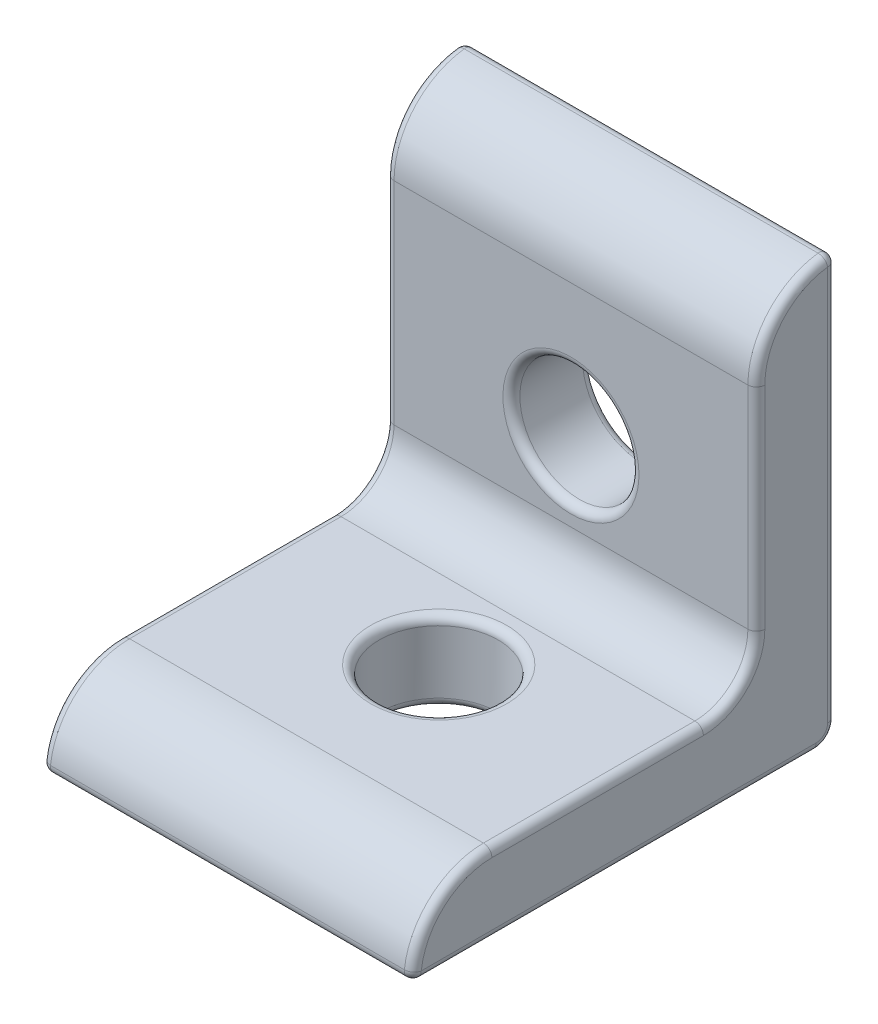
ISO-10303-21;
HEADER;
FILE_DESCRIPTION(('STEP AP214'),'2;1');
FILE_NAME('part.step','',(''),(''),'','','');
FILE_SCHEMA(('AUTOMOTIVE_DESIGN { 1 0 10303 214 1 1 1 1 }'));
ENDSEC;
DATA;
#1=APPLICATION_CONTEXT('core data for automotive mechanical design processes');
#2=APPLICATION_PROTOCOL_DEFINITION('international standard','automotive_design',2000,#1);
#3=PRODUCT_CONTEXT('',#1,'mechanical');
#4=PRODUCT('Part','Part','',(#3));
#5=PRODUCT_RELATED_PRODUCT_CATEGORY('part','',(#4));
#6=PRODUCT_DEFINITION_FORMATION('','',#4);
#7=PRODUCT_DEFINITION_CONTEXT('part definition',#1,'design');
#8=PRODUCT_DEFINITION('design','',#6,#7);
#9=PRODUCT_DEFINITION_SHAPE('','',#8);
#10=(LENGTH_UNIT() NAMED_UNIT(*) SI_UNIT(.MILLI.,.METRE.));
#11=(NAMED_UNIT(*) PLANE_ANGLE_UNIT() SI_UNIT($,.RADIAN.));
#12=(NAMED_UNIT(*) SI_UNIT($,.STERADIAN.) SOLID_ANGLE_UNIT());
#13=UNCERTAINTY_MEASURE_WITH_UNIT(LENGTH_MEASURE(1.E-05),#10,'distance_accuracy_value','');
#14=(GEOMETRIC_REPRESENTATION_CONTEXT(3) GLOBAL_UNCERTAINTY_ASSIGNED_CONTEXT((#13)) GLOBAL_UNIT_ASSIGNED_CONTEXT((#10,
#11,#12)) REPRESENTATION_CONTEXT('',''));
#15=CARTESIAN_POINT('',(0.,0.,0.));
#16=DIRECTION('',(0.,0.,1.));
#17=DIRECTION('',(1.,0.,0.));
#18=AXIS2_PLACEMENT_3D('',#15,#16,#17);
#19=CARTESIAN_POINT('',(-11.1125,-12.7,15.8496));
#20=DIRECTION('',(1.,0.,0.));
#21=DIRECTION('',(0.,0.,-1.));
#22=AXIS2_PLACEMENT_3D('',#19,#20,#21);
#23=CYLINDRICAL_SURFACE('',#22,4.7752);
#24=DIRECTION('',(1.,0.,0.));
#25=VECTOR('',#24,1.);
#26=CARTESIAN_POINT('',(-11.1125,-7.9248,15.8496));
#27=LINE('',#26,#25);
#28=CARTESIAN_POINT('',(-10.6045,-7.9248,15.8496));
#29=VERTEX_POINT('',#28);
#30=CARTESIAN_POINT('',(10.6045,-7.9248,15.8496));
#31=VERTEX_POINT('',#30);
#32=EDGE_CURVE('E213',#29,#31,#27,.T.);
#33=ORIENTED_EDGE('',*,*,#32,.F.);
#34=CARTESIAN_POINT('',(-10.6045,-12.7,15.8496));
#35=DIRECTION('',(1.,0.,0.));
#36=DIRECTION('',(0.,0.,-1.));
#37=AXIS2_PLACEMENT_3D('',#34,#35,#36);
#38=CIRCLE('',#37,4.7752);
#39=CARTESIAN_POINT('',(-10.6045,-12.1315238095238,20.5908413839481));
#40=VERTEX_POINT('',#39);
#41=EDGE_CURVE('E288',#29,#40,#38,.T.);
#42=ORIENTED_EDGE('',*,*,#41,.T.);
#43=DIRECTION('',(1.,0.,0.));
#44=VECTOR('',#43,1.);
#45=CARTESIAN_POINT('',(-11.1125,-12.1315238095238,20.5908413839481));
#46=LINE('',#45,#44);
#47=CARTESIAN_POINT('',(10.6045,-12.1315238095238,20.5908413839481));
#48=VERTEX_POINT('',#47);
#49=EDGE_CURVE('E282',#40,#48,#46,.T.);
#50=ORIENTED_EDGE('',*,*,#49,.T.);
#51=CARTESIAN_POINT('',(10.6045,-12.7,15.8496));
#52=DIRECTION('',(1.,0.,0.));
#53=DIRECTION('',(0.,0.,-1.));
#54=AXIS2_PLACEMENT_3D('',#51,#52,#53);
#55=CIRCLE('',#54,4.7752);
#56=EDGE_CURVE('E285',#48,#31,#55,.F.);
#57=ORIENTED_EDGE('',*,*,#56,.T.);
#58=EDGE_LOOP('',(#33,#42,#50,#57));
#59=FACE_BOUND('',#58,.T.);
#60=ADVANCED_FACE('F45',(#59),#23,.T.);
#61=CARTESIAN_POINT('',(-11.1125,-7.9248,3.175));
#62=DIRECTION('',(0.,1.,0.));
#63=DIRECTION('',(0.,0.,1.));
#64=AXIS2_PLACEMENT_3D('',#61,#62,#63);
#65=PLANE('',#64);
#66=CARTESIAN_POINT('',(0.,-7.9248,7.9248));
#67=DIRECTION('',(0.,1.,0.));
#68=DIRECTION('',(0.,0.,1.));
#69=AXIS2_PLACEMENT_3D('',#66,#67,#68);
#70=CIRCLE('',#69,4.0767);
#71=CARTESIAN_POINT('',(0.,-7.9248,12.0015));
#72=VERTEX_POINT('',#71);
#73=EDGE_CURVE('E420',#72,#72,#70,.F.);
#74=ORIENTED_EDGE('',*,*,#73,.T.);
#75=EDGE_LOOP('',(#74));
#76=FACE_BOUND('',#75,.T.);
#77=DIRECTION('',(1.,0.,0.));
#78=VECTOR('',#77,1.);
#79=CARTESIAN_POINT('',(-11.1125,-7.9248,3.175));
#80=LINE('',#79,#78);
#81=CARTESIAN_POINT('',(-10.6045,-7.9248,3.175));
#82=VERTEX_POINT('',#81);
#83=CARTESIAN_POINT('',(10.6045,-7.9248,3.175));
#84=VERTEX_POINT('',#83);
#85=EDGE_CURVE('E220',#82,#84,#80,.T.);
#86=ORIENTED_EDGE('',*,*,#85,.F.);
#87=DIRECTION('',(0.,0.,1.));
#88=VECTOR('',#87,1.);
#89=CARTESIAN_POINT('',(-10.6045,-7.9248,15.8496));
#90=LINE('',#89,#88);
#91=EDGE_CURVE('E295',#82,#29,#90,.T.);
#92=ORIENTED_EDGE('',*,*,#91,.T.);
#93=ORIENTED_EDGE('',*,*,#32,.T.);
#94=DIRECTION('',(0.,0.,1.));
#95=VECTOR('',#94,1.);
#96=CARTESIAN_POINT('',(10.6045,-7.9248,3.175));
#97=LINE('',#96,#95);
#98=EDGE_CURVE('E292',#31,#84,#97,.F.);
#99=ORIENTED_EDGE('',*,*,#98,.T.);
#100=EDGE_LOOP('',(#86,#92,#93,#99));
#101=FACE_BOUND('',#100,.T.);
#102=ADVANCED_FACE('F529',(#76,#101),#65,.T.);
#103=CARTESIAN_POINT('',(-11.1125,-4.7498,3.175));
#104=DIRECTION('',(1.,0.,0.));
#105=DIRECTION('',(0.,0.,-1.));
#106=AXIS2_PLACEMENT_3D('',#103,#104,#105);
#107=CYLINDRICAL_SURFACE('',#106,3.175);
#108=DIRECTION('',(1.,0.,0.));
#109=VECTOR('',#108,1.);
#110=CARTESIAN_POINT('',(-11.1125,-4.7498,0.));
#111=LINE('',#110,#109);
#112=CARTESIAN_POINT('',(-10.6045,-4.7498,0.));
#113=VERTEX_POINT('',#112);
#114=CARTESIAN_POINT('',(10.6045,-4.7498,0.));
#115=VERTEX_POINT('',#114);
#116=EDGE_CURVE('E611',#113,#115,#111,.T.);
#117=ORIENTED_EDGE('',*,*,#116,.F.);
#118=CARTESIAN_POINT('',(-10.6045,-4.7498,3.175));
#119=DIRECTION('',(1.,0.,0.));
#120=DIRECTION('',(0.,0.,-1.));
#121=AXIS2_PLACEMENT_3D('',#118,#119,#120);
#122=CIRCLE('',#121,3.175);
#123=EDGE_CURVE('E301',#113,#82,#122,.F.);
#124=ORIENTED_EDGE('',*,*,#123,.T.);
#125=ORIENTED_EDGE('',*,*,#85,.T.);
#126=CARTESIAN_POINT('',(10.6045,-4.7498,3.175));
#127=DIRECTION('',(1.,0.,0.));
#128=DIRECTION('',(0.,0.,-1.));
#129=AXIS2_PLACEMENT_3D('',#126,#127,#128);
#130=CIRCLE('',#129,3.175);
#131=EDGE_CURVE('E298',#84,#115,#130,.T.);
#132=ORIENTED_EDGE('',*,*,#131,.T.);
#133=EDGE_LOOP('',(#117,#124,#125,#132));
#134=FACE_BOUND('',#133,.T.);
#135=ADVANCED_FACE('F535',(#134),#107,.F.);
#136=CARTESIAN_POINT('',(-11.1125,7.9248,0.));
#137=DIRECTION('',(0.,0.,1.));
#138=DIRECTION('',(0.,-1.,0.));
#139=AXIS2_PLACEMENT_3D('',#136,#137,#138);
#140=PLANE('',#139);
#141=CARTESIAN_POINT('',(0.,0.,0.));
#142=DIRECTION('',(0.,0.,1.));
#143=DIRECTION('',(0.,-1.,0.));
#144=AXIS2_PLACEMENT_3D('',#141,#142,#143);
#145=CIRCLE('',#144,4.0767);
#146=CARTESIAN_POINT('',(0.,-4.0767,0.));
#147=VERTEX_POINT('',#146);
#148=EDGE_CURVE('E54',#147,#147,#145,.F.);
#149=ORIENTED_EDGE('',*,*,#148,.T.);
#150=EDGE_LOOP('',(#149));
#151=FACE_BOUND('',#150,.T.);
#152=DIRECTION('',(1.,0.,0.));
#153=VECTOR('',#152,1.);
#154=CARTESIAN_POINT('',(-11.1125,7.9248,0.));
#155=LINE('',#154,#153);
#156=CARTESIAN_POINT('',(-10.6045,7.9248,0.));
#157=VERTEX_POINT('',#156);
#158=CARTESIAN_POINT('',(10.6045,7.9248,0.));
#159=VERTEX_POINT('',#158);
#160=EDGE_CURVE('E223',#157,#159,#155,.T.);
#161=ORIENTED_EDGE('',*,*,#160,.F.);
#162=DIRECTION('',(0.,-1.,0.));
#163=VECTOR('',#162,1.);
#164=CARTESIAN_POINT('',(-10.6045,-4.7498,0.));
#165=LINE('',#164,#163);
#166=EDGE_CURVE('E307',#157,#113,#165,.T.);
#167=ORIENTED_EDGE('',*,*,#166,.T.);
#168=ORIENTED_EDGE('',*,*,#116,.T.);
#169=DIRECTION('',(0.,-1.,0.));
#170=VECTOR('',#169,1.);
#171=CARTESIAN_POINT('',(10.6045,7.9248,0.));
#172=LINE('',#171,#170);
#173=EDGE_CURVE('E304',#115,#159,#172,.F.);
#174=ORIENTED_EDGE('',*,*,#173,.T.);
#175=EDGE_LOOP('',(#161,#167,#168,#174));
#176=FACE_BOUND('',#175,.T.);
#177=ADVANCED_FACE('F436',(#151,#176),#140,.T.);
#178=CARTESIAN_POINT('',(-11.1125,7.9248,-4.7752));
#179=DIRECTION('',(1.,0.,0.));
#180=DIRECTION('',(0.,0.,-1.));
#181=AXIS2_PLACEMENT_3D('',#178,#179,#180);
#182=CYLINDRICAL_SURFACE('',#181,4.7752);
#183=DIRECTION('',(1.,0.,0.));
#184=VECTOR('',#183,1.);
#185=CARTESIAN_POINT('',(-11.1125,12.6660413839481,-4.20672380952381));
#186=LINE('',#185,#184);
#187=CARTESIAN_POINT('',(10.6045,12.6660413839481,-4.20672380952381));
#188=VERTEX_POINT('',#187);
#189=CARTESIAN_POINT('',(-10.6045,12.6660413839481,-4.20672380952381));
#190=VERTEX_POINT('',#189);
#191=EDGE_CURVE('E61',#188,#190,#186,.F.);
#192=ORIENTED_EDGE('',*,*,#191,.T.);
#193=CARTESIAN_POINT('',(-10.6045,7.9248,-4.7752));
#194=DIRECTION('',(1.,0.,0.));
#195=DIRECTION('',(0.,0.,-1.));
#196=AXIS2_PLACEMENT_3D('',#193,#194,#195);
#197=CIRCLE('',#196,4.7752);
#198=EDGE_CURVE('E327',#190,#157,#197,.T.);
#199=ORIENTED_EDGE('',*,*,#198,.T.);
#200=ORIENTED_EDGE('',*,*,#160,.T.);
#201=CARTESIAN_POINT('',(10.6045,7.9248,-4.7752));
#202=DIRECTION('',(1.,0.,0.));
#203=DIRECTION('',(0.,0.,-1.));
#204=AXIS2_PLACEMENT_3D('',#201,#202,#203);
#205=CIRCLE('',#204,4.7752);
#206=EDGE_CURVE('E66',#159,#188,#205,.F.);
#207=ORIENTED_EDGE('',*,*,#206,.T.);
#208=EDGE_LOOP('',(#192,#199,#200,#207));
#209=FACE_BOUND('',#208,.T.);
#210=ADVANCED_FACE('F459',(#209),#182,.T.);
#211=CARTESIAN_POINT('',(-11.1125,-12.7,-4.7752));
#212=DIRECTION('',(0.,0.,-1.));
#213=DIRECTION('',(-1.,0.,0.));
#214=AXIS2_PLACEMENT_3D('',#211,#212,#213);
#215=PLANE('',#214);
#216=CARTESIAN_POINT('',(0.,0.,-4.7752));
#217=DIRECTION('',(0.,0.,-1.));
#218=DIRECTION('',(-1.,0.,0.));
#219=AXIS2_PLACEMENT_3D('',#216,#217,#218);
#220=CIRCLE('',#219,4.0767);
#221=CARTESIAN_POINT('',(-4.0767,0.,-4.7752));
#222=VERTEX_POINT('',#221);
#223=EDGE_CURVE('E11',#222,#222,#220,.F.);
#224=ORIENTED_EDGE('',*,*,#223,.T.);
#225=EDGE_LOOP('',(#224));
#226=FACE_BOUND('',#225,.T.);
#227=DIRECTION('',(1.,0.,0.));
#228=VECTOR('',#227,1.);
#229=CARTESIAN_POINT('',(-11.1125,-11.5062,-4.7752));
#230=LINE('',#229,#228);
#231=CARTESIAN_POINT('',(10.6045,-11.5062,-4.7752));
#232=VERTEX_POINT('',#231);
#233=CARTESIAN_POINT('',(-10.6045,-11.5062,-4.7752));
#234=VERTEX_POINT('',#233);
#235=EDGE_CURVE('E212',#232,#234,#230,.F.);
#236=ORIENTED_EDGE('',*,*,#235,.T.);
#237=DIRECTION('',(0.,1.,0.));
#238=VECTOR('',#237,1.);
#239=CARTESIAN_POINT('',(-10.6045,12.7,-4.7752));
#240=LINE('',#239,#238);
#241=CARTESIAN_POINT('',(-10.6045,12.161654002677,-4.7752));
#242=VERTEX_POINT('',#241);
#243=EDGE_CURVE('E320',#234,#242,#240,.T.);
#244=ORIENTED_EDGE('',*,*,#243,.T.);
#245=DIRECTION('',(1.,0.,0.));
#246=VECTOR('',#245,1.);
#247=CARTESIAN_POINT('',(-11.1125,12.161654002677,-4.7752));
#248=LINE('',#247,#246);
#249=CARTESIAN_POINT('',(10.6045,12.161654002677,-4.7752));
#250=VERTEX_POINT('',#249);
#251=EDGE_CURVE('E317',#242,#250,#248,.T.);
#252=ORIENTED_EDGE('',*,*,#251,.T.);
#253=DIRECTION('',(0.,1.,0.));
#254=VECTOR('',#253,1.);
#255=CARTESIAN_POINT('',(10.6045,-12.7,-4.7752));
#256=LINE('',#255,#254);
#257=EDGE_CURVE('E314',#250,#232,#256,.F.);
#258=ORIENTED_EDGE('',*,*,#257,.T.);
#259=EDGE_LOOP('',(#236,#244,#252,#258));
#260=FACE_BOUND('',#259,.T.);
#261=ADVANCED_FACE('F456',(#226,#260),#215,.T.);
#262=CARTESIAN_POINT('',(-11.1125,-12.7,20.6248));
#263=DIRECTION('',(0.,-1.,0.));
#264=DIRECTION('',(0.,0.,-1.));
#265=AXIS2_PLACEMENT_3D('',#262,#263,#264);
#266=PLANE('',#265);
#267=CARTESIAN_POINT('',(0.,-12.7,7.9248));
#268=DIRECTION('',(0.,-1.,0.));
#269=DIRECTION('',(0.,0.,-1.));
#270=AXIS2_PLACEMENT_3D('',#267,#268,#269);
#271=CIRCLE('',#270,4.0767);
#272=CARTESIAN_POINT('',(0.,-12.7,3.8481));
#273=VERTEX_POINT('',#272);
#274=EDGE_CURVE('E206',#273,#273,#271,.F.);
#275=ORIENTED_EDGE('',*,*,#274,.T.);
#276=EDGE_LOOP('',(#275));
#277=FACE_BOUND('',#276,.T.);
#278=DIRECTION('',(1.,0.,0.));
#279=VECTOR('',#278,1.);
#280=CARTESIAN_POINT('',(-11.1125,-12.7,20.086454002677));
#281=LINE('',#280,#279);
#282=CARTESIAN_POINT('',(10.6045,-12.7,20.086454002677));
#283=VERTEX_POINT('',#282);
#284=CARTESIAN_POINT('',(-10.6045,-12.7,20.086454002677));
#285=VERTEX_POINT('',#284);
#286=EDGE_CURVE('E203',#283,#285,#281,.F.);
#287=ORIENTED_EDGE('',*,*,#286,.T.);
#288=DIRECTION('',(0.,0.,-1.));
#289=VECTOR('',#288,1.);
#290=CARTESIAN_POINT('',(-10.6045,-12.7,-3.5814));
#291=LINE('',#290,#289);
#292=CARTESIAN_POINT('',(-10.6045,-12.7,-3.5814));
#293=VERTEX_POINT('',#292);
#294=EDGE_CURVE('E176',#285,#293,#291,.T.);
#295=ORIENTED_EDGE('',*,*,#294,.T.);
#296=DIRECTION('',(1.,0.,0.));
#297=VECTOR('',#296,1.);
#298=CARTESIAN_POINT('',(-11.1125,-12.7,-3.5814));
#299=LINE('',#298,#297);
#300=CARTESIAN_POINT('',(10.6045,-12.7,-3.5814));
#301=VERTEX_POINT('',#300);
#302=EDGE_CURVE('E200',#293,#301,#299,.T.);
#303=ORIENTED_EDGE('',*,*,#302,.T.);
#304=DIRECTION('',(0.,0.,-1.));
#305=VECTOR('',#304,1.);
#306=CARTESIAN_POINT('',(10.6045,-12.7,20.6248));
#307=LINE('',#306,#305);
#308=EDGE_CURVE('E207',#301,#283,#307,.F.);
#309=ORIENTED_EDGE('',*,*,#308,.T.);
#310=EDGE_LOOP('',(#287,#295,#303,#309));
#311=FACE_BOUND('',#310,.T.);
#312=ADVANCED_FACE('F199',(#277,#311),#266,.T.);
#313=CARTESIAN_POINT('',(-11.1125,-12.7,15.8496));
#314=DIRECTION('',(1.,0.,0.));
#315=DIRECTION('',(0.,0.,-1.));
#316=AXIS2_PLACEMENT_3D('',#313,#314,#315);
#317=PLANE('',#316);
#318=CARTESIAN_POINT('',(-11.1125,-11.5062,-3.5814));
#319=DIRECTION('',(1.,0.,0.));
#320=DIRECTION('',(0.,0.,-1.));
#321=AXIS2_PLACEMENT_3D('',#318,#319,#320);
#322=CIRCLE('',#321,0.6858);
#323=CARTESIAN_POINT('',(-11.1125,-11.5062,-4.2672));
#324=VERTEX_POINT('',#323);
#325=CARTESIAN_POINT('',(-11.1125,-12.192,-3.5814));
#326=VERTEX_POINT('',#325);
#327=EDGE_CURVE('E251',#324,#326,#322,.F.);
#328=ORIENTED_EDGE('',*,*,#327,.T.);
#329=DIRECTION('',(0.,0.,-1.));
#330=VECTOR('',#329,1.);
#331=CARTESIAN_POINT('',(-11.1125,-12.192,20.6248));
#332=LINE('',#331,#330);
#333=CARTESIAN_POINT('',(-11.1125,-12.192,20.086454002677));
#334=VERTEX_POINT('',#333);
#335=EDGE_CURVE('E178',#326,#334,#332,.F.);
#336=ORIENTED_EDGE('',*,*,#335,.T.);
#337=CARTESIAN_POINT('',(-11.1125,-12.7,15.8496));
#338=DIRECTION('',(1.,0.,0.));
#339=DIRECTION('',(0.,0.,-1.));
#340=AXIS2_PLACEMENT_3D('',#337,#338,#339);
#341=CIRCLE('',#340,4.2672);
#342=CARTESIAN_POINT('',(-11.1125,-8.4328,15.8496));
#343=VERTEX_POINT('',#342);
#344=EDGE_CURVE('E248',#334,#343,#341,.F.);
#345=ORIENTED_EDGE('',*,*,#344,.T.);
#346=DIRECTION('',(0.,0.,1.));
#347=VECTOR('',#346,1.);
#348=CARTESIAN_POINT('',(-11.1125,-8.4328,3.175));
#349=LINE('',#348,#347);
#350=CARTESIAN_POINT('',(-11.1125,-8.4328,3.175));
#351=VERTEX_POINT('',#350);
#352=EDGE_CURVE('E245',#343,#351,#349,.F.);
#353=ORIENTED_EDGE('',*,*,#352,.T.);
#354=CARTESIAN_POINT('',(-11.1125,-4.7498,3.175));
#355=DIRECTION('',(1.,0.,0.));
#356=DIRECTION('',(0.,0.,-1.));
#357=AXIS2_PLACEMENT_3D('',#354,#355,#356);
#358=CIRCLE('',#357,3.683);
#359=CARTESIAN_POINT('',(-11.1125,-4.7498,-0.508000000000003));
#360=VERTEX_POINT('',#359);
#361=EDGE_CURVE('E242',#351,#360,#358,.T.);
#362=ORIENTED_EDGE('',*,*,#361,.T.);
#363=DIRECTION('',(0.,-1.,0.));
#364=VECTOR('',#363,1.);
#365=CARTESIAN_POINT('',(-11.1125,7.9248,-0.508000000000001));
#366=LINE('',#365,#364);
#367=CARTESIAN_POINT('',(-11.1125,7.9248,-0.508));
#368=VERTEX_POINT('',#367);
#369=EDGE_CURVE('E239',#360,#368,#366,.F.);
#370=ORIENTED_EDGE('',*,*,#369,.T.);
#371=CARTESIAN_POINT('',(-11.1125,7.9248,-4.7752));
#372=DIRECTION('',(1.,0.,0.));
#373=DIRECTION('',(0.,0.,-1.));
#374=AXIS2_PLACEMENT_3D('',#371,#372,#373);
#375=CIRCLE('',#374,4.2672);
#376=CARTESIAN_POINT('',(-11.1125,12.161654002677,-4.2672));
#377=VERTEX_POINT('',#376);
#378=EDGE_CURVE('E233',#368,#377,#375,.F.);
#379=ORIENTED_EDGE('',*,*,#378,.T.);
#380=DIRECTION('',(0.,1.,0.));
#381=VECTOR('',#380,1.);
#382=CARTESIAN_POINT('',(-11.1125,-11.5062,-4.2672));
#383=LINE('',#382,#381);
#384=EDGE_CURVE('E236',#377,#324,#383,.F.);
#385=ORIENTED_EDGE('',*,*,#384,.T.);
#386=EDGE_LOOP('',(#328,#336,#345,#353,#362,#370,#379,#385));
#387=FACE_BOUND('',#386,.T.);
#388=ADVANCED_FACE('F594',(#387),#317,.F.);
#389=CARTESIAN_POINT('',(11.1125,-12.7,15.8496));
#390=DIRECTION('',(1.,0.,0.));
#391=DIRECTION('',(0.,0.,-1.));
#392=AXIS2_PLACEMENT_3D('',#389,#390,#391);
#393=PLANE('',#392);
#394=CARTESIAN_POINT('',(11.1125,-12.7,15.8496));
#395=DIRECTION('',(1.,0.,0.));
#396=DIRECTION('',(0.,0.,-1.));
#397=AXIS2_PLACEMENT_3D('',#394,#395,#396);
#398=CIRCLE('',#397,4.2672);
#399=CARTESIAN_POINT('',(11.1125,-8.4328,15.8496));
#400=VERTEX_POINT('',#399);
#401=CARTESIAN_POINT('',(11.1125,-12.192,20.086454002677));
#402=VERTEX_POINT('',#401);
#403=EDGE_CURVE('E272',#400,#402,#398,.T.);
#404=ORIENTED_EDGE('',*,*,#403,.T.);
#405=DIRECTION('',(0.,0.,-1.));
#406=VECTOR('',#405,1.);
#407=CARTESIAN_POINT('',(11.1125,-12.192,15.8496));
#408=LINE('',#407,#406);
#409=CARTESIAN_POINT('',(11.1125,-12.192,-3.5814));
#410=VERTEX_POINT('',#409);
#411=EDGE_CURVE('E278',#402,#410,#408,.T.);
#412=ORIENTED_EDGE('',*,*,#411,.T.);
#413=CARTESIAN_POINT('',(11.1125,-11.5062,-3.5814));
#414=DIRECTION('',(1.,0.,0.));
#415=DIRECTION('',(0.,0.,-1.));
#416=AXIS2_PLACEMENT_3D('',#413,#414,#415);
#417=CIRCLE('',#416,0.6858);
#418=CARTESIAN_POINT('',(11.1125,-11.5062,-4.2672));
#419=VERTEX_POINT('',#418);
#420=EDGE_CURVE('E275',#410,#419,#417,.T.);
#421=ORIENTED_EDGE('',*,*,#420,.T.);
#422=DIRECTION('',(0.,1.,0.));
#423=VECTOR('',#422,1.);
#424=CARTESIAN_POINT('',(11.1125,-12.7,-4.2672));
#425=LINE('',#424,#423);
#426=CARTESIAN_POINT('',(11.1125,12.161654002677,-4.2672));
#427=VERTEX_POINT('',#426);
#428=EDGE_CURVE('E260',#419,#427,#425,.T.);
#429=ORIENTED_EDGE('',*,*,#428,.T.);
#430=CARTESIAN_POINT('',(11.1125,7.9248,-4.7752));
#431=DIRECTION('',(1.,0.,0.));
#432=DIRECTION('',(0.,0.,-1.));
#433=AXIS2_PLACEMENT_3D('',#430,#431,#432);
#434=CIRCLE('',#433,4.2672);
#435=CARTESIAN_POINT('',(11.1125,7.9248,-0.508));
#436=VERTEX_POINT('',#435);
#437=EDGE_CURVE('E194',#427,#436,#434,.T.);
#438=ORIENTED_EDGE('',*,*,#437,.T.);
#439=DIRECTION('',(0.,-1.,0.));
#440=VECTOR('',#439,1.);
#441=CARTESIAN_POINT('',(11.1125,-12.7,-0.508000000000005));
#442=LINE('',#441,#440);
#443=CARTESIAN_POINT('',(11.1125,-4.7498,-0.508000000000004));
#444=VERTEX_POINT('',#443);
#445=EDGE_CURVE('E263',#436,#444,#442,.T.);
#446=ORIENTED_EDGE('',*,*,#445,.T.);
#447=CARTESIAN_POINT('',(11.1125,-4.7498,3.175));
#448=DIRECTION('',(1.,0.,0.));
#449=DIRECTION('',(0.,0.,-1.));
#450=AXIS2_PLACEMENT_3D('',#447,#448,#449);
#451=CIRCLE('',#450,3.683);
#452=CARTESIAN_POINT('',(11.1125,-8.4328,3.175));
#453=VERTEX_POINT('',#452);
#454=EDGE_CURVE('E266',#444,#453,#451,.F.);
#455=ORIENTED_EDGE('',*,*,#454,.T.);
#456=DIRECTION('',(0.,0.,1.));
#457=VECTOR('',#456,1.);
#458=CARTESIAN_POINT('',(11.1125,-8.4328,15.8496));
#459=LINE('',#458,#457);
#460=EDGE_CURVE('E269',#453,#400,#459,.T.);
#461=ORIENTED_EDGE('',*,*,#460,.T.);
#462=EDGE_LOOP('',(#404,#412,#421,#429,#438,#446,#455,#461));
#463=FACE_BOUND('',#462,.T.);
#464=ADVANCED_FACE('F488',(#463),#393,.T.);
#465=CARTESIAN_POINT('',(-11.1125,-11.5062,-3.5814));
#466=DIRECTION('',(1.,0.,0.));
#467=DIRECTION('',(0.,0.,-1.));
#468=AXIS2_PLACEMENT_3D('',#465,#466,#467);
#469=CYLINDRICAL_SURFACE('',#468,1.1938);
#470=ORIENTED_EDGE('',*,*,#302,.F.);
#471=CARTESIAN_POINT('',(-10.6045,-11.5062,-3.5814));
#472=DIRECTION('',(1.,0.,0.));
#473=DIRECTION('',(0.,0.,-1.));
#474=AXIS2_PLACEMENT_3D('',#471,#472,#473);
#475=CIRCLE('',#474,1.1938);
#476=EDGE_CURVE('E185',#293,#234,#475,.T.);
#477=ORIENTED_EDGE('',*,*,#476,.T.);
#478=ORIENTED_EDGE('',*,*,#235,.F.);
#479=CARTESIAN_POINT('',(10.6045,-11.5062,-3.5814));
#480=DIRECTION('',(1.,0.,0.));
#481=DIRECTION('',(0.,0.,-1.));
#482=AXIS2_PLACEMENT_3D('',#479,#480,#481);
#483=CIRCLE('',#482,1.1938);
#484=EDGE_CURVE('E195',#232,#301,#483,.F.);
#485=ORIENTED_EDGE('',*,*,#484,.T.);
#486=EDGE_LOOP('',(#470,#477,#478,#485));
#487=FACE_BOUND('',#486,.T.);
#488=ADVANCED_FACE('F209',(#487),#469,.T.);
#489=CARTESIAN_POINT('',(0.,0.,-4.7752));
#490=DIRECTION('',(0.,0.,1.));
#491=DIRECTION('',(1.,0.,0.));
#492=AXIS2_PLACEMENT_3D('',#489,#490,#491);
#493=CYLINDRICAL_SURFACE('',#492,3.5687);
#494=CARTESIAN_POINT('',(0.,0.,-0.508000000000002));
#495=DIRECTION('',(0.,0.,1.));
#496=DIRECTION('',(0.,-1.,0.));
#497=AXIS2_PLACEMENT_3D('',#494,#495,#496);
#498=CIRCLE('',#497,3.5687);
#499=CARTESIAN_POINT('',(0.,-3.5687,-0.508000000000002));
#500=VERTEX_POINT('',#499);
#501=EDGE_CURVE('E428',#500,#500,#498,.T.);
#502=ORIENTED_EDGE('',*,*,#501,.T.);
#503=EDGE_LOOP('',(#502));
#504=FACE_BOUND('',#503,.T.);
#505=CARTESIAN_POINT('',(0.,0.,-4.2672));
#506=DIRECTION('',(0.,0.,-1.));
#507=DIRECTION('',(-1.,0.,0.));
#508=AXIS2_PLACEMENT_3D('',#505,#506,#507);
#509=CIRCLE('',#508,3.5687);
#510=CARTESIAN_POINT('',(-3.5687,0.,-4.2672));
#511=VERTEX_POINT('',#510);
#512=EDGE_CURVE('E424',#511,#511,#509,.T.);
#513=ORIENTED_EDGE('',*,*,#512,.T.);
#514=EDGE_LOOP('',(#513));
#515=FACE_BOUND('',#514,.T.);
#516=ADVANCED_FACE('F445',(#504,#515),#493,.F.);
#517=CARTESIAN_POINT('',(0.,-12.7,7.9248));
#518=DIRECTION('',(0.,1.,0.));
#519=DIRECTION('',(0.,0.,1.));
#520=AXIS2_PLACEMENT_3D('',#517,#518,#519);
#521=CYLINDRICAL_SURFACE('',#520,3.5687);
#522=CARTESIAN_POINT('',(0.,-8.4328,7.9248));
#523=DIRECTION('',(0.,1.,0.));
#524=DIRECTION('',(0.,0.,1.));
#525=AXIS2_PLACEMENT_3D('',#522,#523,#524);
#526=CIRCLE('',#525,3.5687);
#527=CARTESIAN_POINT('',(0.,-8.4328,11.4935));
#528=VERTEX_POINT('',#527);
#529=EDGE_CURVE('E329',#528,#528,#526,.T.);
#530=ORIENTED_EDGE('',*,*,#529,.T.);
#531=EDGE_LOOP('',(#530));
#532=FACE_BOUND('',#531,.T.);
#533=CARTESIAN_POINT('',(0.,-12.192,7.9248));
#534=DIRECTION('',(0.,-1.,0.));
#535=DIRECTION('',(0.,0.,-1.));
#536=AXIS2_PLACEMENT_3D('',#533,#534,#535);
#537=CIRCLE('',#536,3.5687);
#538=CARTESIAN_POINT('',(0.,-12.192,4.3561));
#539=VERTEX_POINT('',#538);
#540=EDGE_CURVE('E310',#539,#539,#537,.T.);
#541=ORIENTED_EDGE('',*,*,#540,.T.);
#542=EDGE_LOOP('',(#541));
#543=FACE_BOUND('',#542,.T.);
#544=ADVANCED_FACE('F448',(#532,#543),#521,.F.);
#545=CARTESIAN_POINT('',(10.6045,-12.7,-0.508000000000005));
#546=DIRECTION('',(0.,-1.,0.));
#547=DIRECTION('',(0.,0.,-1.));
#548=AXIS2_PLACEMENT_3D('',#545,#546,#547);
#549=CYLINDRICAL_SURFACE('',#548,0.508);
#550=CARTESIAN_POINT('',(10.6045,7.9248,-0.508000000000001));
#551=DIRECTION('',(0.,1.,0.));
#552=DIRECTION('',(0.,0.,1.));
#553=AXIS2_PLACEMENT_3D('',#550,#551,#552);
#554=CIRCLE('',#553,0.508);
#555=EDGE_CURVE('E409',#159,#436,#554,.T.);
#556=ORIENTED_EDGE('',*,*,#555,.F.);
#557=ORIENTED_EDGE('',*,*,#173,.F.);
#558=CARTESIAN_POINT('',(10.6045,-4.7498,-0.508000000000004));
#559=DIRECTION('',(0.,-1.,0.));
#560=DIRECTION('',(0.,0.,-1.));
#561=AXIS2_PLACEMENT_3D('',#558,#559,#560);
#562=CIRCLE('',#561,0.508);
#563=EDGE_CURVE('E413',#444,#115,#562,.T.);
#564=ORIENTED_EDGE('',*,*,#563,.F.);
#565=ORIENTED_EDGE('',*,*,#445,.F.);
#566=EDGE_LOOP('',(#556,#557,#564,#565));
#567=FACE_BOUND('',#566,.T.);
#568=ADVANCED_FACE('F491',(#567),#549,.T.);
#569=CARTESIAN_POINT('',(10.6045,-4.7498,3.175));
#570=DIRECTION('',(1.,0.,0.));
#571=DIRECTION('',(0.,0.,-1.));
#572=AXIS2_PLACEMENT_3D('',#569,#570,#571);
#573=TOROIDAL_SURFACE('',#572,3.683,0.508);
#574=ORIENTED_EDGE('',*,*,#563,.T.);
#575=ORIENTED_EDGE('',*,*,#131,.F.);
#576=CARTESIAN_POINT('',(10.6045,-8.4328,3.175));
#577=DIRECTION('',(0.,0.,1.));
#578=DIRECTION('',(1.,0.,0.));
#579=AXIS2_PLACEMENT_3D('',#576,#577,#578);
#580=CIRCLE('',#579,0.508);
#581=EDGE_CURVE('E405',#453,#84,#580,.T.);
#582=ORIENTED_EDGE('',*,*,#581,.F.);
#583=ORIENTED_EDGE('',*,*,#454,.F.);
#584=EDGE_LOOP('',(#574,#575,#582,#583));
#585=FACE_BOUND('',#584,.T.);
#586=ADVANCED_FACE('F497',(#585),#573,.T.);
#587=CARTESIAN_POINT('',(10.6045,-12.7,-4.2672));
#588=DIRECTION('',(0.,1.,0.));
#589=DIRECTION('',(0.,0.,1.));
#590=AXIS2_PLACEMENT_3D('',#587,#588,#589);
#591=CYLINDRICAL_SURFACE('',#590,0.508);
#592=CARTESIAN_POINT('',(10.6045,12.161654002677,-4.2672));
#593=DIRECTION('',(0.,1.,0.));
#594=DIRECTION('',(0.,0.,1.));
#595=AXIS2_PLACEMENT_3D('',#592,#593,#594);
#596=CIRCLE('',#595,0.508);
#597=EDGE_CURVE('E397',#427,#250,#596,.T.);
#598=ORIENTED_EDGE('',*,*,#597,.F.);
#599=ORIENTED_EDGE('',*,*,#428,.F.);
#600=CARTESIAN_POINT('',(10.6045,-11.5062,-4.2672));
#601=DIRECTION('',(0.,-1.,0.));
#602=DIRECTION('',(0.,0.,-1.));
#603=AXIS2_PLACEMENT_3D('',#600,#601,#602);
#604=CIRCLE('',#603,0.508);
#605=EDGE_CURVE('E401',#232,#419,#604,.T.);
#606=ORIENTED_EDGE('',*,*,#605,.F.);
#607=ORIENTED_EDGE('',*,*,#257,.F.);
#608=EDGE_LOOP('',(#598,#599,#606,#607));
#609=FACE_BOUND('',#608,.T.);
#610=ADVANCED_FACE('F478',(#609),#591,.T.);
#611=CARTESIAN_POINT('',(10.6045,7.9248,-4.7752));
#612=DIRECTION('',(1.,0.,0.));
#613=DIRECTION('',(0.,0.,-1.));
#614=AXIS2_PLACEMENT_3D('',#611,#612,#613);
#615=TOROIDAL_SURFACE('',#614,4.2672,0.508);
#616=ORIENTED_EDGE('',*,*,#555,.T.);
#617=ORIENTED_EDGE('',*,*,#437,.F.);
#618=CARTESIAN_POINT('',(10.6045,12.161654002677,-4.2672));
#619=DIRECTION('',(0.,0.119047619047619,-0.992888545809193));
#620=DIRECTION('',(0.,0.992888545809193,0.119047619047619));
#621=AXIS2_PLACEMENT_3D('',#618,#619,#620);
#622=CIRCLE('',#621,0.508);
#623=EDGE_CURVE('E393',#188,#427,#622,.T.);
#624=ORIENTED_EDGE('',*,*,#623,.F.);
#625=ORIENTED_EDGE('',*,*,#206,.F.);
#626=EDGE_LOOP('',(#616,#617,#624,#625));
#627=FACE_BOUND('',#626,.T.);
#628=ADVANCED_FACE('F484',(#627),#615,.T.);
#629=CARTESIAN_POINT('',(10.6045,-8.4328,15.8496));
#630=DIRECTION('',(0.,0.,1.));
#631=DIRECTION('',(1.,0.,0.));
#632=AXIS2_PLACEMENT_3D('',#629,#630,#631);
#633=CYLINDRICAL_SURFACE('',#632,0.508);
#634=ORIENTED_EDGE('',*,*,#581,.T.);
#635=ORIENTED_EDGE('',*,*,#98,.F.);
#636=CARTESIAN_POINT('',(10.6045,-8.4328,15.8496));
#637=DIRECTION('',(0.,0.,1.));
#638=DIRECTION('',(1.,0.,0.));
#639=AXIS2_PLACEMENT_3D('',#636,#637,#638);
#640=CIRCLE('',#639,0.508);
#641=EDGE_CURVE('E385',#400,#31,#640,.T.);
#642=ORIENTED_EDGE('',*,*,#641,.F.);
#643=ORIENTED_EDGE('',*,*,#460,.F.);
#644=EDGE_LOOP('',(#634,#635,#642,#643));
#645=FACE_BOUND('',#644,.T.);
#646=ADVANCED_FACE('F504',(#645),#633,.T.);
#647=CARTESIAN_POINT('',(10.6045,-11.5062,-3.5814));
#648=DIRECTION('',(1.,0.,0.));
#649=DIRECTION('',(0.,0.,-1.));
#650=AXIS2_PLACEMENT_3D('',#647,#648,#649);
#651=TOROIDAL_SURFACE('',#650,0.6858,0.508);
#652=ORIENTED_EDGE('',*,*,#605,.T.);
#653=ORIENTED_EDGE('',*,*,#420,.F.);
#654=CARTESIAN_POINT('',(10.6045,-12.192,-3.5814));
#655=DIRECTION('',(0.,0.,1.));
#656=DIRECTION('',(1.,0.,0.));
#657=AXIS2_PLACEMENT_3D('',#654,#655,#656);
#658=CIRCLE('',#657,0.508);
#659=EDGE_CURVE('E382',#301,#410,#658,.T.);
#660=ORIENTED_EDGE('',*,*,#659,.F.);
#661=ORIENTED_EDGE('',*,*,#484,.F.);
#662=EDGE_LOOP('',(#652,#653,#660,#661));
#663=FACE_BOUND('',#662,.T.);
#664=ADVANCED_FACE('F518',(#663),#651,.T.);
#665=CARTESIAN_POINT('',(10.6045,12.161654002677,-4.2672));
#666=DIRECTION('',(0.,0.,1.));
#667=DIRECTION('',(1.,0.,0.));
#668=AXIS2_PLACEMENT_3D('',#665,#666,#667);
#669=SPHERICAL_SURFACE('',#668,0.508);
#670=ORIENTED_EDGE('',*,*,#623,.T.);
#671=ORIENTED_EDGE('',*,*,#597,.T.);
#672=CARTESIAN_POINT('',(10.6045,12.161654002677,-4.2672));
#673=DIRECTION('',(1.,0.,0.));
#674=DIRECTION('',(0.,1.,0.));
#675=AXIS2_PLACEMENT_3D('',#672,#673,#674);
#676=CIRCLE('',#675,0.508);
#677=EDGE_CURVE('E378',#188,#250,#676,.F.);
#678=ORIENTED_EDGE('',*,*,#677,.F.);
#679=EDGE_LOOP('',(#670,#671,#678));
#680=FACE_BOUND('',#679,.T.);
#681=ADVANCED_FACE('F481',(#680),#669,.T.);
#682=CARTESIAN_POINT('',(-10.6045,7.9248,-0.508000000000001));
#683=DIRECTION('',(0.,1.,0.));
#684=DIRECTION('',(0.,0.,1.));
#685=AXIS2_PLACEMENT_3D('',#682,#683,#684);
#686=CYLINDRICAL_SURFACE('',#685,0.508);
#687=CARTESIAN_POINT('',(-10.6045,7.9248,-0.508000000000001));
#688=DIRECTION('',(0.,1.,0.));
#689=DIRECTION('',(0.,0.,1.));
#690=AXIS2_PLACEMENT_3D('',#687,#688,#689);
#691=CIRCLE('',#690,0.508);
#692=EDGE_CURVE('E374',#368,#157,#691,.T.);
#693=ORIENTED_EDGE('',*,*,#692,.F.);
#694=ORIENTED_EDGE('',*,*,#369,.F.);
#695=CARTESIAN_POINT('',(-10.6045,-4.7498,-0.508000000000003));
#696=DIRECTION('',(0.,-1.,0.));
#697=DIRECTION('',(0.,0.,-1.));
#698=AXIS2_PLACEMENT_3D('',#695,#696,#697);
#699=CIRCLE('',#698,0.508);
#700=EDGE_CURVE('E389',#113,#360,#699,.T.);
#701=ORIENTED_EDGE('',*,*,#700,.F.);
#702=ORIENTED_EDGE('',*,*,#166,.F.);
#703=EDGE_LOOP('',(#693,#694,#701,#702));
#704=FACE_BOUND('',#703,.T.);
#705=ADVANCED_FACE('F525',(#704),#686,.T.);
#706=CARTESIAN_POINT('',(-10.6045,-4.7498,3.175));
#707=DIRECTION('',(1.,0.,0.));
#708=DIRECTION('',(0.,0.,-1.));
#709=AXIS2_PLACEMENT_3D('',#706,#707,#708);
#710=TOROIDAL_SURFACE('',#709,3.683,0.508);
#711=ORIENTED_EDGE('',*,*,#700,.T.);
#712=ORIENTED_EDGE('',*,*,#361,.F.);
#713=CARTESIAN_POINT('',(-10.6045,-8.4328,3.175));
#714=DIRECTION('',(0.,0.,1.));
#715=DIRECTION('',(1.,0.,0.));
#716=AXIS2_PLACEMENT_3D('',#713,#714,#715);
#717=CIRCLE('',#716,0.508);
#718=EDGE_CURVE('E370',#82,#351,#717,.T.);
#719=ORIENTED_EDGE('',*,*,#718,.F.);
#720=ORIENTED_EDGE('',*,*,#123,.F.);
#721=EDGE_LOOP('',(#711,#712,#719,#720));
#722=FACE_BOUND('',#721,.T.);
#723=ADVANCED_FACE('F580',(#722),#710,.T.);
#724=CARTESIAN_POINT('',(10.6045,-12.7,15.8496));
#725=DIRECTION('',(1.,0.,0.));
#726=DIRECTION('',(0.,0.,-1.));
#727=AXIS2_PLACEMENT_3D('',#724,#725,#726);
#728=TOROIDAL_SURFACE('',#727,4.2672,0.508);
#729=ORIENTED_EDGE('',*,*,#641,.T.);
#730=ORIENTED_EDGE('',*,*,#56,.F.);
#731=CARTESIAN_POINT('',(10.6045,-12.192,20.086454002677));
#732=DIRECTION('',(0.,-0.992888545809193,0.11904761904762));
#733=DIRECTION('',(0.,-0.11904761904762,-0.992888545809193));
#734=AXIS2_PLACEMENT_3D('',#731,#732,#733);
#735=CIRCLE('',#734,0.508);
#736=EDGE_CURVE('E366',#402,#48,#735,.T.);
#737=ORIENTED_EDGE('',*,*,#736,.F.);
#738=ORIENTED_EDGE('',*,*,#403,.F.);
#739=EDGE_LOOP('',(#729,#730,#737,#738));
#740=FACE_BOUND('',#739,.T.);
#741=ADVANCED_FACE('F508',(#740),#728,.T.);
#742=CARTESIAN_POINT('',(10.6045,-12.192,15.8496));
#743=DIRECTION('',(0.,0.,-1.));
#744=DIRECTION('',(-1.,0.,0.));
#745=AXIS2_PLACEMENT_3D('',#742,#743,#744);
#746=CYLINDRICAL_SURFACE('',#745,0.508);
#747=ORIENTED_EDGE('',*,*,#659,.T.);
#748=ORIENTED_EDGE('',*,*,#411,.F.);
#749=CARTESIAN_POINT('',(10.6045,-12.192,20.086454002677));
#750=DIRECTION('',(0.,0.,1.));
#751=DIRECTION('',(1.,0.,0.));
#752=AXIS2_PLACEMENT_3D('',#749,#750,#751);
#753=CIRCLE('',#752,0.508);
#754=EDGE_CURVE('E362',#283,#402,#753,.T.);
#755=ORIENTED_EDGE('',*,*,#754,.F.);
#756=ORIENTED_EDGE('',*,*,#308,.F.);
#757=EDGE_LOOP('',(#747,#748,#755,#756));
#758=FACE_BOUND('',#757,.T.);
#759=ADVANCED_FACE('F515',(#758),#746,.T.);
#760=CARTESIAN_POINT('',(-11.1125,12.161654002677,-4.2672));
#761=DIRECTION('',(1.,0.,0.));
#762=DIRECTION('',(0.,0.,-1.));
#763=AXIS2_PLACEMENT_3D('',#760,#761,#762);
#764=CYLINDRICAL_SURFACE('',#763,0.508);
#765=ORIENTED_EDGE('',*,*,#677,.T.);
#766=ORIENTED_EDGE('',*,*,#251,.F.);
#767=CARTESIAN_POINT('',(-10.6045,12.161654002677,-4.2672));
#768=DIRECTION('',(-1.,0.,0.));
#769=DIRECTION('',(0.,0.,1.));
#770=AXIS2_PLACEMENT_3D('',#767,#768,#769);
#771=CIRCLE('',#770,0.508);
#772=EDGE_CURVE('E358',#190,#242,#771,.T.);
#773=ORIENTED_EDGE('',*,*,#772,.F.);
#774=ORIENTED_EDGE('',*,*,#191,.F.);
#775=EDGE_LOOP('',(#765,#766,#773,#774));
#776=FACE_BOUND('',#775,.T.);
#777=ADVANCED_FACE('F474',(#776),#764,.T.);
#778=CARTESIAN_POINT('',(-10.6045,7.9248,-4.7752));
#779=DIRECTION('',(1.,0.,0.));
#780=DIRECTION('',(0.,0.,-1.));
#781=AXIS2_PLACEMENT_3D('',#778,#779,#780);
#782=TOROIDAL_SURFACE('',#781,4.2672,0.508);
#783=ORIENTED_EDGE('',*,*,#692,.T.);
#784=ORIENTED_EDGE('',*,*,#198,.F.);
#785=CARTESIAN_POINT('',(-10.6045,12.161654002677,-4.2672));
#786=DIRECTION('',(0.,0.11904761904762,-0.992888545809193));
#787=DIRECTION('',(0.,0.992888545809193,0.11904761904762));
#788=AXIS2_PLACEMENT_3D('',#785,#786,#787);
#789=CIRCLE('',#788,0.508);
#790=EDGE_CURVE('E354',#377,#190,#789,.T.);
#791=ORIENTED_EDGE('',*,*,#790,.F.);
#792=ORIENTED_EDGE('',*,*,#378,.F.);
#793=EDGE_LOOP('',(#783,#784,#791,#792));
#794=FACE_BOUND('',#793,.T.);
#795=ADVANCED_FACE('F569',(#794),#782,.T.);
#796=CARTESIAN_POINT('',(-10.6045,-8.4328,3.175));
#797=DIRECTION('',(0.,0.,-1.));
#798=DIRECTION('',(-1.,0.,0.));
#799=AXIS2_PLACEMENT_3D('',#796,#797,#798);
#800=CYLINDRICAL_SURFACE('',#799,0.508);
#801=ORIENTED_EDGE('',*,*,#718,.T.);
#802=ORIENTED_EDGE('',*,*,#352,.F.);
#803=CARTESIAN_POINT('',(-10.6045,-8.4328,15.8496));
#804=DIRECTION('',(0.,0.,1.));
#805=DIRECTION('',(1.,0.,0.));
#806=AXIS2_PLACEMENT_3D('',#803,#804,#805);
#807=CIRCLE('',#806,0.508);
#808=EDGE_CURVE('E350',#29,#343,#807,.T.);
#809=ORIENTED_EDGE('',*,*,#808,.F.);
#810=ORIENTED_EDGE('',*,*,#91,.F.);
#811=EDGE_LOOP('',(#801,#802,#809,#810));
#812=FACE_BOUND('',#811,.T.);
#813=ADVANCED_FACE('F566',(#812),#800,.T.);
#814=CARTESIAN_POINT('',(10.6045,-12.192,20.086454002677));
#815=DIRECTION('',(0.,0.,1.));
#816=DIRECTION('',(1.,0.,0.));
#817=AXIS2_PLACEMENT_3D('',#814,#815,#816);
#818=SPHERICAL_SURFACE('',#817,0.508);
#819=ORIENTED_EDGE('',*,*,#754,.T.);
#820=ORIENTED_EDGE('',*,*,#736,.T.);
#821=CARTESIAN_POINT('',(10.6045,-12.192,20.086454002677));
#822=DIRECTION('',(1.,0.,0.));
#823=DIRECTION('',(0.,1.,0.));
#824=AXIS2_PLACEMENT_3D('',#821,#822,#823);
#825=CIRCLE('',#824,0.508);
#826=EDGE_CURVE('E346',#283,#48,#825,.F.);
#827=ORIENTED_EDGE('',*,*,#826,.F.);
#828=EDGE_LOOP('',(#819,#820,#827));
#829=FACE_BOUND('',#828,.T.);
#830=ADVANCED_FACE('F512',(#829),#818,.T.);
#831=CARTESIAN_POINT('',(-10.6045,12.161654002677,-4.2672));
#832=DIRECTION('',(0.,0.,1.));
#833=DIRECTION('',(1.,0.,0.));
#834=AXIS2_PLACEMENT_3D('',#831,#832,#833);
#835=SPHERICAL_SURFACE('',#834,0.508);
#836=ORIENTED_EDGE('',*,*,#790,.T.);
#837=ORIENTED_EDGE('',*,*,#772,.T.);
#838=CARTESIAN_POINT('',(-10.6045,12.161654002677,-4.2672));
#839=DIRECTION('',(0.,1.,0.));
#840=DIRECTION('',(-1.,0.,0.));
#841=AXIS2_PLACEMENT_3D('',#838,#839,#840);
#842=CIRCLE('',#841,0.508);
#843=EDGE_CURVE('E342',#377,#242,#842,.F.);
#844=ORIENTED_EDGE('',*,*,#843,.F.);
#845=EDGE_LOOP('',(#836,#837,#844));
#846=FACE_BOUND('',#845,.T.);
#847=ADVANCED_FACE('F470',(#846),#835,.T.);
#848=CARTESIAN_POINT('',(-10.6045,-12.7,15.8496));
#849=DIRECTION('',(1.,0.,0.));
#850=DIRECTION('',(0.,0.,-1.));
#851=AXIS2_PLACEMENT_3D('',#848,#849,#850);
#852=TOROIDAL_SURFACE('',#851,4.2672,0.508);
#853=ORIENTED_EDGE('',*,*,#808,.T.);
#854=ORIENTED_EDGE('',*,*,#344,.F.);
#855=CARTESIAN_POINT('',(-10.6045,-12.192,20.086454002677));
#856=DIRECTION('',(0.,-0.992888545809193,0.11904761904762));
#857=DIRECTION('',(0.,-0.11904761904762,-0.992888545809193));
#858=AXIS2_PLACEMENT_3D('',#855,#856,#857);
#859=CIRCLE('',#858,0.508);
#860=EDGE_CURVE('E338',#40,#334,#859,.T.);
#861=ORIENTED_EDGE('',*,*,#860,.F.);
#862=ORIENTED_EDGE('',*,*,#41,.F.);
#863=EDGE_LOOP('',(#853,#854,#861,#862));
#864=FACE_BOUND('',#863,.T.);
#865=ADVANCED_FACE('F557',(#864),#852,.T.);
#866=CARTESIAN_POINT('',(-11.1125,-12.192,20.086454002677));
#867=DIRECTION('',(1.,0.,0.));
#868=DIRECTION('',(0.,0.,-1.));
#869=AXIS2_PLACEMENT_3D('',#866,#867,#868);
#870=CYLINDRICAL_SURFACE('',#869,0.508);
#871=ORIENTED_EDGE('',*,*,#826,.T.);
#872=ORIENTED_EDGE('',*,*,#49,.F.);
#873=CARTESIAN_POINT('',(-10.6045,-12.192,20.086454002677));
#874=DIRECTION('',(-1.,0.,0.));
#875=DIRECTION('',(0.,0.,1.));
#876=AXIS2_PLACEMENT_3D('',#873,#874,#875);
#877=CIRCLE('',#876,0.508);
#878=EDGE_CURVE('E335',#285,#40,#877,.T.);
#879=ORIENTED_EDGE('',*,*,#878,.F.);
#880=ORIENTED_EDGE('',*,*,#286,.F.);
#881=EDGE_LOOP('',(#871,#872,#879,#880));
#882=FACE_BOUND('',#881,.T.);
#883=ADVANCED_FACE('F554',(#882),#870,.T.);
#884=CARTESIAN_POINT('',(-10.6045,-12.7,-4.2672));
#885=DIRECTION('',(0.,-1.,0.));
#886=DIRECTION('',(0.,0.,-1.));
#887=AXIS2_PLACEMENT_3D('',#884,#885,#886);
#888=CYLINDRICAL_SURFACE('',#887,0.508);
#889=ORIENTED_EDGE('',*,*,#843,.T.);
#890=ORIENTED_EDGE('',*,*,#243,.F.);
#891=CARTESIAN_POINT('',(-10.6045,-11.5062,-4.2672));
#892=DIRECTION('',(0.,-1.,0.));
#893=DIRECTION('',(0.,0.,-1.));
#894=AXIS2_PLACEMENT_3D('',#891,#892,#893);
#895=CIRCLE('',#894,0.508);
#896=EDGE_CURVE('E188',#324,#234,#895,.T.);
#897=ORIENTED_EDGE('',*,*,#896,.F.);
#898=ORIENTED_EDGE('',*,*,#384,.F.);
#899=EDGE_LOOP('',(#889,#890,#897,#898));
#900=FACE_BOUND('',#899,.T.);
#901=ADVANCED_FACE('F466',(#900),#888,.T.);
#902=CARTESIAN_POINT('',(-10.6045,-12.192,20.086454002677));
#903=DIRECTION('',(0.,0.,1.));
#904=DIRECTION('',(1.,0.,0.));
#905=AXIS2_PLACEMENT_3D('',#902,#903,#904);
#906=SPHERICAL_SURFACE('',#905,0.508);
#907=ORIENTED_EDGE('',*,*,#878,.T.);
#908=ORIENTED_EDGE('',*,*,#860,.T.);
#909=CARTESIAN_POINT('',(-10.6045,-12.192,20.086454002677));
#910=DIRECTION('',(0.,0.,1.));
#911=DIRECTION('',(0.,-1.,0.));
#912=AXIS2_PLACEMENT_3D('',#909,#910,#911);
#913=CIRCLE('',#912,0.508);
#914=EDGE_CURVE('E182',#285,#334,#913,.F.);
#915=ORIENTED_EDGE('',*,*,#914,.F.);
#916=EDGE_LOOP('',(#907,#908,#915));
#917=FACE_BOUND('',#916,.T.);
#918=ADVANCED_FACE('F548',(#917),#906,.T.);
#919=CARTESIAN_POINT('',(-10.6045,-11.5062,-3.5814));
#920=DIRECTION('',(1.,0.,0.));
#921=DIRECTION('',(0.,0.,-1.));
#922=AXIS2_PLACEMENT_3D('',#919,#920,#921);
#923=TOROIDAL_SURFACE('',#922,0.6858,0.508);
#924=ORIENTED_EDGE('',*,*,#896,.T.);
#925=ORIENTED_EDGE('',*,*,#476,.F.);
#926=CARTESIAN_POINT('',(-10.6045,-12.192,-3.5814));
#927=DIRECTION('',(0.,0.,1.));
#928=DIRECTION('',(1.,0.,0.));
#929=AXIS2_PLACEMENT_3D('',#926,#927,#928);
#930=CIRCLE('',#929,0.508);
#931=EDGE_CURVE('E172',#326,#293,#930,.T.);
#932=ORIENTED_EDGE('',*,*,#931,.F.);
#933=ORIENTED_EDGE('',*,*,#327,.F.);
#934=EDGE_LOOP('',(#924,#925,#932,#933));
#935=FACE_BOUND('',#934,.T.);
#936=ADVANCED_FACE('F186',(#935),#923,.T.);
#937=CARTESIAN_POINT('',(-10.6045,-12.192,20.6248));
#938=DIRECTION('',(0.,0.,1.));
#939=DIRECTION('',(1.,0.,0.));
#940=AXIS2_PLACEMENT_3D('',#937,#938,#939);
#941=CYLINDRICAL_SURFACE('',#940,0.508);
#942=ORIENTED_EDGE('',*,*,#914,.T.);
#943=ORIENTED_EDGE('',*,*,#335,.F.);
#944=ORIENTED_EDGE('',*,*,#931,.T.);
#945=ORIENTED_EDGE('',*,*,#294,.F.);
#946=EDGE_LOOP('',(#942,#943,#944,#945));
#947=FACE_BOUND('',#946,.T.);
#948=ADVANCED_FACE('F174',(#947),#941,.T.);
#949=CARTESIAN_POINT('',(0.,-12.192,7.9248));
#950=DIRECTION('',(0.,-1.,0.));
#951=DIRECTION('',(0.,0.,-1.));
#952=AXIS2_PLACEMENT_3D('',#949,#950,#951);
#953=TOROIDAL_SURFACE('',#952,4.0767,0.508);
#954=ORIENTED_EDGE('',*,*,#540,.F.);
#955=EDGE_LOOP('',(#954));
#956=FACE_BOUND('',#955,.T.);
#957=ORIENTED_EDGE('',*,*,#274,.F.);
#958=EDGE_LOOP('',(#957));
#959=FACE_BOUND('',#958,.T.);
#960=ADVANCED_FACE('F545',(#956,#959),#953,.T.);
#961=CARTESIAN_POINT('',(0.,-8.4328,7.9248));
#962=DIRECTION('',(0.,1.,0.));
#963=DIRECTION('',(0.,0.,1.));
#964=AXIS2_PLACEMENT_3D('',#961,#962,#963);
#965=TOROIDAL_SURFACE('',#964,4.0767,0.508);
#966=ORIENTED_EDGE('',*,*,#73,.F.);
#967=EDGE_LOOP('',(#966));
#968=FACE_BOUND('',#967,.T.);
#969=ORIENTED_EDGE('',*,*,#529,.F.);
#970=EDGE_LOOP('',(#969));
#971=FACE_BOUND('',#970,.T.);
#972=ADVANCED_FACE('F442',(#968,#971),#965,.T.);
#973=CARTESIAN_POINT('',(0.,0.,-0.508000000000002));
#974=DIRECTION('',(0.,0.,1.));
#975=DIRECTION('',(0.,-1.,0.));
#976=AXIS2_PLACEMENT_3D('',#973,#974,#975);
#977=TOROIDAL_SURFACE('',#976,4.0767,0.508);
#978=ORIENTED_EDGE('',*,*,#148,.F.);
#979=EDGE_LOOP('',(#978));
#980=FACE_BOUND('',#979,.T.);
#981=ORIENTED_EDGE('',*,*,#501,.F.);
#982=EDGE_LOOP('',(#981));
#983=FACE_BOUND('',#982,.T.);
#984=ADVANCED_FACE('F439',(#980,#983),#977,.T.);
#985=CARTESIAN_POINT('',(0.,0.,-4.2672));
#986=DIRECTION('',(0.,0.,-1.));
#987=DIRECTION('',(-1.,0.,0.));
#988=AXIS2_PLACEMENT_3D('',#985,#986,#987);
#989=TOROIDAL_SURFACE('',#988,4.0767,0.508);
#990=ORIENTED_EDGE('',*,*,#512,.F.);
#991=EDGE_LOOP('',(#990));
#992=FACE_BOUND('',#991,.T.);
#993=ORIENTED_EDGE('',*,*,#223,.F.);
#994=EDGE_LOOP('',(#993));
#995=FACE_BOUND('',#994,.T.);
#996=ADVANCED_FACE('F47',(#992,#995),#989,.T.);
#997=CLOSED_SHELL('',(#60,#102,#135,#177,#210,#261,#312,#388,#464,#488,#516,#544,#568,#586,#610,
#628,#646,#664,#681,#705,#723,#741,#759,#777,#795,#813,#830,#847,#865,#883,#901,#918,#936,#948,
#960,#972,#984,#996));
#998=MANIFOLD_SOLID_BREP('B2',#997);
#999=ADVANCED_BREP_SHAPE_REPRESENTATION('',(#18,#998),#14);
#1000=SHAPE_DEFINITION_REPRESENTATION(#9,#999);
ENDSEC;
END-ISO-10303-21;
